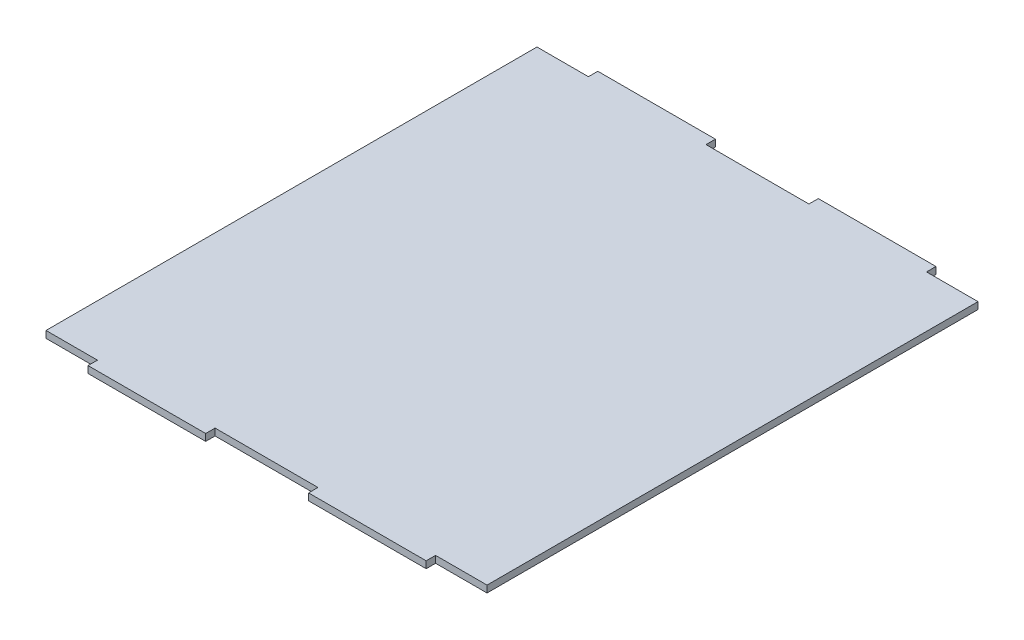
ISO-10303-21;
HEADER;
FILE_DESCRIPTION(('STEP AP214'),'2;1');
FILE_NAME('part.step','',(''),(''),'','','');
FILE_SCHEMA(('AUTOMOTIVE_DESIGN { 1 0 10303 214 1 1 1 1 }'));
ENDSEC;
DATA;
#1=APPLICATION_CONTEXT('core data for automotive mechanical design processes');
#2=APPLICATION_PROTOCOL_DEFINITION('international standard','automotive_design',2000,#1);
#3=PRODUCT_CONTEXT('',#1,'mechanical');
#4=PRODUCT('Part','Part','',(#3));
#5=PRODUCT_RELATED_PRODUCT_CATEGORY('part','',(#4));
#6=PRODUCT_DEFINITION_FORMATION('','',#4);
#7=PRODUCT_DEFINITION_CONTEXT('part definition',#1,'design');
#8=PRODUCT_DEFINITION('design','',#6,#7);
#9=PRODUCT_DEFINITION_SHAPE('','',#8);
#10=(LENGTH_UNIT() NAMED_UNIT(*) SI_UNIT(.MILLI.,.METRE.));
#11=(NAMED_UNIT(*) PLANE_ANGLE_UNIT() SI_UNIT($,.RADIAN.));
#12=(NAMED_UNIT(*) SI_UNIT($,.STERADIAN.) SOLID_ANGLE_UNIT());
#13=UNCERTAINTY_MEASURE_WITH_UNIT(LENGTH_MEASURE(1.E-05),#10,'distance_accuracy_value','');
#14=(GEOMETRIC_REPRESENTATION_CONTEXT(3) GLOBAL_UNCERTAINTY_ASSIGNED_CONTEXT((#13)) GLOBAL_UNIT_ASSIGNED_CONTEXT((#10,
#11,#12)) REPRESENTATION_CONTEXT('',''));
#15=CARTESIAN_POINT('',(0.,0.,0.));
#16=DIRECTION('',(0.,0.,1.));
#17=DIRECTION('',(1.,0.,0.));
#18=AXIS2_PLACEMENT_3D('',#15,#16,#17);
#19=CARTESIAN_POINT('',(708.021771772831,6.7818,384.048));
#20=DIRECTION('',(0.,0.,1.));
#21=DIRECTION('',(1.,0.,0.));
#22=AXIS2_PLACEMENT_3D('',#19,#20,#21);
#23=PLANE('',#22);
#24=DIRECTION('',(-1.,0.,0.));
#25=VECTOR('',#24,1.);
#26=CARTESIAN_POINT('',(708.021771772831,3.81,384.048));
#27=LINE('',#26,#25);
#28=CARTESIAN_POINT('',(730.246771772831,3.81,384.048));
#29=VERTEX_POINT('',#28);
#30=CARTESIAN_POINT('',(708.021771772831,3.81,384.048));
#31=VERTEX_POINT('',#30);
#32=EDGE_CURVE('E202',#29,#31,#27,.T.);
#33=ORIENTED_EDGE('',*,*,#32,.T.);
#34=DIRECTION('',(0.,-1.,0.));
#35=VECTOR('',#34,1.);
#36=CARTESIAN_POINT('',(708.021771772831,6.7818,384.048));
#37=LINE('',#36,#35);
#38=CARTESIAN_POINT('',(708.021771772831,6.7818,384.048));
#39=VERTEX_POINT('',#38);
#40=EDGE_CURVE('E11',#39,#31,#37,.T.);
#41=ORIENTED_EDGE('',*,*,#40,.F.);
#42=DIRECTION('',(-1.,0.,0.));
#43=VECTOR('',#42,1.);
#44=CARTESIAN_POINT('',(708.021771772831,6.7818,384.048));
#45=LINE('',#44,#43);
#46=CARTESIAN_POINT('',(730.246771772831,6.7818,384.048));
#47=VERTEX_POINT('',#46);
#48=EDGE_CURVE('E240',#47,#39,#45,.T.);
#49=ORIENTED_EDGE('',*,*,#48,.F.);
#50=DIRECTION('',(0.,-1.,0.));
#51=VECTOR('',#50,1.);
#52=CARTESIAN_POINT('',(730.246771772831,6.7818,384.048));
#53=LINE('',#52,#51);
#54=EDGE_CURVE('E198',#47,#29,#53,.T.);
#55=ORIENTED_EDGE('',*,*,#54,.T.);
#56=EDGE_LOOP('',(#33,#41,#49,#55));
#57=FACE_BOUND('',#56,.T.);
#58=ADVANCED_FACE('F34',(#57),#23,.F.);
#59=CARTESIAN_POINT('',(708.021771772831,6.7818,379.984));
#60=DIRECTION('',(-1.,0.,0.));
#61=DIRECTION('',(0.,0.,1.));
#62=AXIS2_PLACEMENT_3D('',#59,#60,#61);
#63=PLANE('',#62);
#64=DIRECTION('',(0.,0.,-1.));
#65=VECTOR('',#64,1.);
#66=CARTESIAN_POINT('',(708.021771772831,3.81,379.984));
#67=LINE('',#66,#65);
#68=CARTESIAN_POINT('',(708.021771772831,3.81,379.984));
#69=VERTEX_POINT('',#68);
#70=EDGE_CURVE('E205',#31,#69,#67,.T.);
#71=ORIENTED_EDGE('',*,*,#70,.T.);
#72=DIRECTION('',(0.,-1.,0.));
#73=VECTOR('',#72,1.);
#74=CARTESIAN_POINT('',(708.021771772831,6.7818,379.984));
#75=LINE('',#74,#73);
#76=CARTESIAN_POINT('',(708.021771772831,6.7818,379.984));
#77=VERTEX_POINT('',#76);
#78=EDGE_CURVE('E42',#77,#69,#75,.T.);
#79=ORIENTED_EDGE('',*,*,#78,.F.);
#80=DIRECTION('',(0.,0.,-1.));
#81=VECTOR('',#80,1.);
#82=CARTESIAN_POINT('',(708.021771772831,6.7818,379.984));
#83=LINE('',#82,#81);
#84=EDGE_CURVE('E129',#39,#77,#83,.T.);
#85=ORIENTED_EDGE('',*,*,#84,.F.);
#86=ORIENTED_EDGE('',*,*,#40,.T.);
#87=EDGE_LOOP('',(#71,#79,#85,#86));
#88=FACE_BOUND('',#87,.T.);
#89=ADVANCED_FACE('F358',(#88),#63,.F.);
#90=CARTESIAN_POINT('',(657.221771772832,6.7818,379.984));
#91=DIRECTION('',(0.,0.,1.));
#92=DIRECTION('',(1.,0.,0.));
#93=AXIS2_PLACEMENT_3D('',#90,#91,#92);
#94=PLANE('',#93);
#95=DIRECTION('',(-1.,0.,0.));
#96=VECTOR('',#95,1.);
#97=CARTESIAN_POINT('',(657.221771772832,3.81,379.984));
#98=LINE('',#97,#96);
#99=CARTESIAN_POINT('',(657.221771772832,3.81,379.984));
#100=VERTEX_POINT('',#99);
#101=EDGE_CURVE('E207',#69,#100,#98,.T.);
#102=ORIENTED_EDGE('',*,*,#101,.T.);
#103=DIRECTION('',(0.,-1.,0.));
#104=VECTOR('',#103,1.);
#105=CARTESIAN_POINT('',(657.221771772832,6.7818,379.984));
#106=LINE('',#105,#104);
#107=CARTESIAN_POINT('',(657.221771772832,6.7818,379.984));
#108=VERTEX_POINT('',#107);
#109=EDGE_CURVE('E283',#108,#100,#106,.T.);
#110=ORIENTED_EDGE('',*,*,#109,.F.);
#111=DIRECTION('',(-1.,0.,0.));
#112=VECTOR('',#111,1.);
#113=CARTESIAN_POINT('',(657.221771772832,6.7818,379.984));
#114=LINE('',#113,#112);
#115=EDGE_CURVE('E291',#77,#108,#114,.T.);
#116=ORIENTED_EDGE('',*,*,#115,.F.);
#117=ORIENTED_EDGE('',*,*,#78,.T.);
#118=EDGE_LOOP('',(#102,#110,#116,#117));
#119=FACE_BOUND('',#118,.T.);
#120=ADVANCED_FACE('F289',(#119),#94,.F.);
#121=CARTESIAN_POINT('',(657.221771772832,6.7818,379.984));
#122=DIRECTION('',(1.,0.,0.));
#123=DIRECTION('',(0.,0.,-1.));
#124=AXIS2_PLACEMENT_3D('',#121,#122,#123);
#125=PLANE('',#124);
#126=DIRECTION('',(0.,0.,1.));
#127=VECTOR('',#126,1.);
#128=CARTESIAN_POINT('',(657.221771772832,3.81,379.984));
#129=LINE('',#128,#127);
#130=CARTESIAN_POINT('',(657.221771772832,3.81,384.048));
#131=VERTEX_POINT('',#130);
#132=EDGE_CURVE('E209',#100,#131,#129,.T.);
#133=ORIENTED_EDGE('',*,*,#132,.T.);
#134=DIRECTION('',(0.,-1.,0.));
#135=VECTOR('',#134,1.);
#136=CARTESIAN_POINT('',(657.221771772832,6.7818,384.048));
#137=LINE('',#136,#135);
#138=CARTESIAN_POINT('',(657.221771772832,6.7818,384.048));
#139=VERTEX_POINT('',#138);
#140=EDGE_CURVE('E280',#139,#131,#137,.T.);
#141=ORIENTED_EDGE('',*,*,#140,.F.);
#142=DIRECTION('',(0.,0.,1.));
#143=VECTOR('',#142,1.);
#144=CARTESIAN_POINT('',(657.221771772832,6.7818,379.984));
#145=LINE('',#144,#143);
#146=EDGE_CURVE('E309',#108,#139,#145,.T.);
#147=ORIENTED_EDGE('',*,*,#146,.F.);
#148=ORIENTED_EDGE('',*,*,#109,.T.);
#149=EDGE_LOOP('',(#133,#141,#147,#148));
#150=FACE_BOUND('',#149,.T.);
#151=ADVANCED_FACE('F300',(#150),#125,.F.);
#152=CARTESIAN_POINT('',(612.771771772831,6.7818,384.048));
#153=DIRECTION('',(0.,0.,1.));
#154=DIRECTION('',(1.,0.,0.));
#155=AXIS2_PLACEMENT_3D('',#152,#153,#154);
#156=PLANE('',#155);
#157=DIRECTION('',(-1.,0.,0.));
#158=VECTOR('',#157,1.);
#159=CARTESIAN_POINT('',(612.771771772831,3.81,384.048));
#160=LINE('',#159,#158);
#161=CARTESIAN_POINT('',(612.771771772831,3.81,384.048));
#162=VERTEX_POINT('',#161);
#163=EDGE_CURVE('E211',#131,#162,#160,.T.);
#164=ORIENTED_EDGE('',*,*,#163,.T.);
#165=DIRECTION('',(0.,-1.,0.));
#166=VECTOR('',#165,1.);
#167=CARTESIAN_POINT('',(612.771771772831,6.7818,384.048));
#168=LINE('',#167,#166);
#169=CARTESIAN_POINT('',(612.771771772831,6.7818,384.048));
#170=VERTEX_POINT('',#169);
#171=EDGE_CURVE('E277',#170,#162,#168,.T.);
#172=ORIENTED_EDGE('',*,*,#171,.F.);
#173=DIRECTION('',(-1.,0.,0.));
#174=VECTOR('',#173,1.);
#175=CARTESIAN_POINT('',(612.771771772831,6.7818,384.048));
#176=LINE('',#175,#174);
#177=EDGE_CURVE('E306',#139,#170,#176,.T.);
#178=ORIENTED_EDGE('',*,*,#177,.F.);
#179=ORIENTED_EDGE('',*,*,#140,.T.);
#180=EDGE_LOOP('',(#164,#172,#178,#179));
#181=FACE_BOUND('',#180,.T.);
#182=ADVANCED_FACE('F304',(#181),#156,.F.);
#183=CARTESIAN_POINT('',(612.771771772831,6.7818,379.984));
#184=DIRECTION('',(-1.,0.,0.));
#185=DIRECTION('',(0.,0.,1.));
#186=AXIS2_PLACEMENT_3D('',#183,#184,#185);
#187=PLANE('',#186);
#188=DIRECTION('',(0.,0.,-1.));
#189=VECTOR('',#188,1.);
#190=CARTESIAN_POINT('',(612.771771772831,3.81,379.984));
#191=LINE('',#190,#189);
#192=CARTESIAN_POINT('',(612.771771772831,3.81,379.984));
#193=VERTEX_POINT('',#192);
#194=EDGE_CURVE('E213',#162,#193,#191,.T.);
#195=ORIENTED_EDGE('',*,*,#194,.T.);
#196=DIRECTION('',(0.,-1.,0.));
#197=VECTOR('',#196,1.);
#198=CARTESIAN_POINT('',(612.771771772831,6.7818,379.984));
#199=LINE('',#198,#197);
#200=CARTESIAN_POINT('',(612.771771772831,6.7818,379.984));
#201=VERTEX_POINT('',#200);
#202=EDGE_CURVE('E274',#201,#193,#199,.T.);
#203=ORIENTED_EDGE('',*,*,#202,.F.);
#204=DIRECTION('',(0.,0.,-1.));
#205=VECTOR('',#204,1.);
#206=CARTESIAN_POINT('',(612.771771772831,6.7818,379.984));
#207=LINE('',#206,#205);
#208=EDGE_CURVE('E308',#170,#201,#207,.T.);
#209=ORIENTED_EDGE('',*,*,#208,.F.);
#210=ORIENTED_EDGE('',*,*,#171,.T.);
#211=EDGE_LOOP('',(#195,#203,#209,#210));
#212=FACE_BOUND('',#211,.T.);
#213=ADVANCED_FACE('F371',(#212),#187,.F.);
#214=CARTESIAN_POINT('',(561.971771772831,6.7818,379.984));
#215=DIRECTION('',(0.,0.,1.));
#216=DIRECTION('',(1.,0.,0.));
#217=AXIS2_PLACEMENT_3D('',#214,#215,#216);
#218=PLANE('',#217);
#219=DIRECTION('',(-1.,0.,0.));
#220=VECTOR('',#219,1.);
#221=CARTESIAN_POINT('',(561.971771772831,3.81,379.984));
#222=LINE('',#221,#220);
#223=CARTESIAN_POINT('',(561.971771772831,3.81,379.984));
#224=VERTEX_POINT('',#223);
#225=EDGE_CURVE('E215',#193,#224,#222,.T.);
#226=ORIENTED_EDGE('',*,*,#225,.T.);
#227=DIRECTION('',(0.,-1.,0.));
#228=VECTOR('',#227,1.);
#229=CARTESIAN_POINT('',(561.971771772831,6.7818,379.984));
#230=LINE('',#229,#228);
#231=CARTESIAN_POINT('',(561.971771772831,6.7818,379.984));
#232=VERTEX_POINT('',#231);
#233=EDGE_CURVE('E271',#232,#224,#230,.T.);
#234=ORIENTED_EDGE('',*,*,#233,.F.);
#235=DIRECTION('',(-1.,0.,0.));
#236=VECTOR('',#235,1.);
#237=CARTESIAN_POINT('',(561.971771772831,6.7818,379.984));
#238=LINE('',#237,#236);
#239=EDGE_CURVE('E311',#201,#232,#238,.T.);
#240=ORIENTED_EDGE('',*,*,#239,.F.);
#241=ORIENTED_EDGE('',*,*,#202,.T.);
#242=EDGE_LOOP('',(#226,#234,#240,#241));
#243=FACE_BOUND('',#242,.T.);
#244=ADVANCED_FACE('F374',(#243),#218,.F.);
#245=CARTESIAN_POINT('',(561.971771772831,6.7818,379.984));
#246=DIRECTION('',(1.,0.,0.));
#247=DIRECTION('',(0.,0.,-1.));
#248=AXIS2_PLACEMENT_3D('',#245,#246,#247);
#249=PLANE('',#248);
#250=DIRECTION('',(0.,0.,1.));
#251=VECTOR('',#250,1.);
#252=CARTESIAN_POINT('',(561.971771772831,3.81,379.984));
#253=LINE('',#252,#251);
#254=CARTESIAN_POINT('',(561.971771772831,3.81,384.048));
#255=VERTEX_POINT('',#254);
#256=EDGE_CURVE('E217',#224,#255,#253,.T.);
#257=ORIENTED_EDGE('',*,*,#256,.T.);
#258=DIRECTION('',(0.,-1.,0.));
#259=VECTOR('',#258,1.);
#260=CARTESIAN_POINT('',(561.971771772831,6.7818,384.048));
#261=LINE('',#260,#259);
#262=CARTESIAN_POINT('',(561.971771772831,6.7818,384.048));
#263=VERTEX_POINT('',#262);
#264=EDGE_CURVE('E268',#263,#255,#261,.T.);
#265=ORIENTED_EDGE('',*,*,#264,.F.);
#266=DIRECTION('',(0.,0.,1.));
#267=VECTOR('',#266,1.);
#268=CARTESIAN_POINT('',(561.971771772831,6.7818,379.984));
#269=LINE('',#268,#267);
#270=EDGE_CURVE('E317',#232,#263,#269,.T.);
#271=ORIENTED_EDGE('',*,*,#270,.F.);
#272=ORIENTED_EDGE('',*,*,#233,.T.);
#273=EDGE_LOOP('',(#257,#265,#271,#272));
#274=FACE_BOUND('',#273,.T.);
#275=ADVANCED_FACE('F378',(#274),#249,.F.);
#276=CARTESIAN_POINT('',(539.746771772831,6.7818,384.048));
#277=DIRECTION('',(0.,0.,1.));
#278=DIRECTION('',(1.,0.,0.));
#279=AXIS2_PLACEMENT_3D('',#276,#277,#278);
#280=PLANE('',#279);
#281=DIRECTION('',(-1.,0.,0.));
#282=VECTOR('',#281,1.);
#283=CARTESIAN_POINT('',(539.746771772831,3.81,384.048));
#284=LINE('',#283,#282);
#285=CARTESIAN_POINT('',(539.746771772831,3.81,384.048));
#286=VERTEX_POINT('',#285);
#287=EDGE_CURVE('E219',#255,#286,#284,.T.);
#288=ORIENTED_EDGE('',*,*,#287,.T.);
#289=DIRECTION('',(0.,-1.,0.));
#290=VECTOR('',#289,1.);
#291=CARTESIAN_POINT('',(539.746771772831,6.7818,384.048));
#292=LINE('',#291,#290);
#293=CARTESIAN_POINT('',(539.746771772831,6.7818,384.048));
#294=VERTEX_POINT('',#293);
#295=EDGE_CURVE('E265',#294,#286,#292,.T.);
#296=ORIENTED_EDGE('',*,*,#295,.F.);
#297=DIRECTION('',(-1.,0.,0.));
#298=VECTOR('',#297,1.);
#299=CARTESIAN_POINT('',(539.746771772831,6.7818,384.048));
#300=LINE('',#299,#298);
#301=EDGE_CURVE('E319',#263,#294,#300,.T.);
#302=ORIENTED_EDGE('',*,*,#301,.F.);
#303=ORIENTED_EDGE('',*,*,#264,.T.);
#304=EDGE_LOOP('',(#288,#296,#302,#303));
#305=FACE_BOUND('',#304,.T.);
#306=ADVANCED_FACE('F382',(#305),#280,.F.);
#307=CARTESIAN_POINT('',(539.746771772831,6.7818,384.048));
#308=DIRECTION('',(1.,0.,0.));
#309=DIRECTION('',(0.,0.,-1.));
#310=AXIS2_PLACEMENT_3D('',#307,#308,#309);
#311=PLANE('',#310);
#312=DIRECTION('',(0.,0.,1.));
#313=VECTOR('',#312,1.);
#314=CARTESIAN_POINT('',(539.746771772831,3.81,384.048));
#315=LINE('',#314,#313);
#316=CARTESIAN_POINT('',(539.746771772831,3.81,596.1126));
#317=VERTEX_POINT('',#316);
#318=EDGE_CURVE('E221',#286,#317,#315,.T.);
#319=ORIENTED_EDGE('',*,*,#318,.T.);
#320=DIRECTION('',(0.,-1.,0.));
#321=VECTOR('',#320,1.);
#322=CARTESIAN_POINT('',(539.746771772831,6.7818,596.1126));
#323=LINE('',#322,#321);
#324=CARTESIAN_POINT('',(539.746771772831,6.7818,596.1126));
#325=VERTEX_POINT('',#324);
#326=EDGE_CURVE('E262',#325,#317,#323,.T.);
#327=ORIENTED_EDGE('',*,*,#326,.F.);
#328=DIRECTION('',(0.,0.,1.));
#329=VECTOR('',#328,1.);
#330=CARTESIAN_POINT('',(539.746771772831,6.7818,384.048));
#331=LINE('',#330,#329);
#332=EDGE_CURVE('E321',#294,#325,#331,.T.);
#333=ORIENTED_EDGE('',*,*,#332,.F.);
#334=ORIENTED_EDGE('',*,*,#295,.T.);
#335=EDGE_LOOP('',(#319,#327,#333,#334));
#336=FACE_BOUND('',#335,.T.);
#337=ADVANCED_FACE('F386',(#336),#311,.F.);
#338=CARTESIAN_POINT('',(539.746771772831,6.7818,596.1126));
#339=DIRECTION('',(0.,0.,-1.));
#340=DIRECTION('',(-1.,0.,0.));
#341=AXIS2_PLACEMENT_3D('',#338,#339,#340);
#342=PLANE('',#341);
#343=DIRECTION('',(1.,0.,0.));
#344=VECTOR('',#343,1.);
#345=CARTESIAN_POINT('',(539.746771772831,3.81,596.1126));
#346=LINE('',#345,#344);
#347=CARTESIAN_POINT('',(561.971771772831,3.81,596.1126));
#348=VERTEX_POINT('',#347);
#349=EDGE_CURVE('E223',#317,#348,#346,.T.);
#350=ORIENTED_EDGE('',*,*,#349,.T.);
#351=DIRECTION('',(0.,-1.,0.));
#352=VECTOR('',#351,1.);
#353=CARTESIAN_POINT('',(561.971771772831,6.7818,596.1126));
#354=LINE('',#353,#352);
#355=CARTESIAN_POINT('',(561.971771772831,6.7818,596.1126));
#356=VERTEX_POINT('',#355);
#357=EDGE_CURVE('E259',#356,#348,#354,.T.);
#358=ORIENTED_EDGE('',*,*,#357,.F.);
#359=DIRECTION('',(1.,0.,0.));
#360=VECTOR('',#359,1.);
#361=CARTESIAN_POINT('',(539.746771772831,6.7818,596.1126));
#362=LINE('',#361,#360);
#363=EDGE_CURVE('E323',#325,#356,#362,.T.);
#364=ORIENTED_EDGE('',*,*,#363,.F.);
#365=ORIENTED_EDGE('',*,*,#326,.T.);
#366=EDGE_LOOP('',(#350,#358,#364,#365));
#367=FACE_BOUND('',#366,.T.);
#368=ADVANCED_FACE('F390',(#367),#342,.F.);
#369=CARTESIAN_POINT('',(561.971771772831,6.7818,596.1126));
#370=DIRECTION('',(1.,0.,0.));
#371=DIRECTION('',(0.,0.,-1.));
#372=AXIS2_PLACEMENT_3D('',#369,#370,#371);
#373=PLANE('',#372);
#374=DIRECTION('',(0.,0.,1.));
#375=VECTOR('',#374,1.);
#376=CARTESIAN_POINT('',(561.971771772831,3.81,596.1126));
#377=LINE('',#376,#375);
#378=CARTESIAN_POINT('',(561.971771772831,3.81,600.1766));
#379=VERTEX_POINT('',#378);
#380=EDGE_CURVE('E225',#348,#379,#377,.T.);
#381=ORIENTED_EDGE('',*,*,#380,.T.);
#382=DIRECTION('',(0.,-1.,0.));
#383=VECTOR('',#382,1.);
#384=CARTESIAN_POINT('',(561.971771772831,6.7818,600.1766));
#385=LINE('',#384,#383);
#386=CARTESIAN_POINT('',(561.971771772831,6.7818,600.1766));
#387=VERTEX_POINT('',#386);
#388=EDGE_CURVE('E256',#387,#379,#385,.T.);
#389=ORIENTED_EDGE('',*,*,#388,.F.);
#390=DIRECTION('',(0.,0.,1.));
#391=VECTOR('',#390,1.);
#392=CARTESIAN_POINT('',(561.971771772831,6.7818,596.1126));
#393=LINE('',#392,#391);
#394=EDGE_CURVE('E325',#356,#387,#393,.T.);
#395=ORIENTED_EDGE('',*,*,#394,.F.);
#396=ORIENTED_EDGE('',*,*,#357,.T.);
#397=EDGE_LOOP('',(#381,#389,#395,#396));
#398=FACE_BOUND('',#397,.T.);
#399=ADVANCED_FACE('F394',(#398),#373,.F.);
#400=CARTESIAN_POINT('',(561.971771772831,6.7818,600.1766));
#401=DIRECTION('',(0.,0.,-1.));
#402=DIRECTION('',(-1.,0.,0.));
#403=AXIS2_PLACEMENT_3D('',#400,#401,#402);
#404=PLANE('',#403);
#405=DIRECTION('',(1.,0.,0.));
#406=VECTOR('',#405,1.);
#407=CARTESIAN_POINT('',(561.971771772831,3.81,600.1766));
#408=LINE('',#407,#406);
#409=CARTESIAN_POINT('',(612.771771772831,3.81,600.1766));
#410=VERTEX_POINT('',#409);
#411=EDGE_CURVE('E227',#379,#410,#408,.T.);
#412=ORIENTED_EDGE('',*,*,#411,.T.);
#413=DIRECTION('',(0.,-1.,0.));
#414=VECTOR('',#413,1.);
#415=CARTESIAN_POINT('',(612.771771772831,6.7818,600.1766));
#416=LINE('',#415,#414);
#417=CARTESIAN_POINT('',(612.771771772831,6.7818,600.1766));
#418=VERTEX_POINT('',#417);
#419=EDGE_CURVE('E253',#418,#410,#416,.T.);
#420=ORIENTED_EDGE('',*,*,#419,.F.);
#421=DIRECTION('',(1.,0.,0.));
#422=VECTOR('',#421,1.);
#423=CARTESIAN_POINT('',(561.971771772831,6.7818,600.1766));
#424=LINE('',#423,#422);
#425=EDGE_CURVE('E327',#387,#418,#424,.T.);
#426=ORIENTED_EDGE('',*,*,#425,.F.);
#427=ORIENTED_EDGE('',*,*,#388,.T.);
#428=EDGE_LOOP('',(#412,#420,#426,#427));
#429=FACE_BOUND('',#428,.T.);
#430=ADVANCED_FACE('F398',(#429),#404,.F.);
#431=CARTESIAN_POINT('',(612.771771772831,6.7818,600.1766));
#432=DIRECTION('',(-1.,0.,0.));
#433=DIRECTION('',(0.,0.,1.));
#434=AXIS2_PLACEMENT_3D('',#431,#432,#433);
#435=PLANE('',#434);
#436=DIRECTION('',(0.,0.,-1.));
#437=VECTOR('',#436,1.);
#438=CARTESIAN_POINT('',(612.771771772831,3.81,600.1766));
#439=LINE('',#438,#437);
#440=CARTESIAN_POINT('',(612.771771772831,3.81,596.1126));
#441=VERTEX_POINT('',#440);
#442=EDGE_CURVE('E229',#410,#441,#439,.T.);
#443=ORIENTED_EDGE('',*,*,#442,.T.);
#444=DIRECTION('',(0.,-1.,0.));
#445=VECTOR('',#444,1.);
#446=CARTESIAN_POINT('',(612.771771772831,6.7818,596.1126));
#447=LINE('',#446,#445);
#448=CARTESIAN_POINT('',(612.771771772831,6.7818,596.1126));
#449=VERTEX_POINT('',#448);
#450=EDGE_CURVE('E250',#449,#441,#447,.T.);
#451=ORIENTED_EDGE('',*,*,#450,.F.);
#452=DIRECTION('',(0.,0.,-1.));
#453=VECTOR('',#452,1.);
#454=CARTESIAN_POINT('',(612.771771772831,6.7818,600.1766));
#455=LINE('',#454,#453);
#456=EDGE_CURVE('E329',#418,#449,#455,.T.);
#457=ORIENTED_EDGE('',*,*,#456,.F.);
#458=ORIENTED_EDGE('',*,*,#419,.T.);
#459=EDGE_LOOP('',(#443,#451,#457,#458));
#460=FACE_BOUND('',#459,.T.);
#461=ADVANCED_FACE('F402',(#460),#435,.F.);
#462=CARTESIAN_POINT('',(612.771771772831,6.7818,596.1126));
#463=DIRECTION('',(0.,0.,-1.));
#464=DIRECTION('',(-1.,0.,0.));
#465=AXIS2_PLACEMENT_3D('',#462,#463,#464);
#466=PLANE('',#465);
#467=DIRECTION('',(1.,0.,0.));
#468=VECTOR('',#467,1.);
#469=CARTESIAN_POINT('',(612.771771772831,3.81,596.1126));
#470=LINE('',#469,#468);
#471=CARTESIAN_POINT('',(657.221771772832,3.81,596.1126));
#472=VERTEX_POINT('',#471);
#473=EDGE_CURVE('E231',#441,#472,#470,.T.);
#474=ORIENTED_EDGE('',*,*,#473,.T.);
#475=DIRECTION('',(0.,-1.,0.));
#476=VECTOR('',#475,1.);
#477=CARTESIAN_POINT('',(657.221771772832,6.7818,596.1126));
#478=LINE('',#477,#476);
#479=CARTESIAN_POINT('',(657.221771772832,6.7818,596.1126));
#480=VERTEX_POINT('',#479);
#481=EDGE_CURVE('E247',#480,#472,#478,.T.);
#482=ORIENTED_EDGE('',*,*,#481,.F.);
#483=DIRECTION('',(1.,0.,0.));
#484=VECTOR('',#483,1.);
#485=CARTESIAN_POINT('',(612.771771772831,6.7818,596.1126));
#486=LINE('',#485,#484);
#487=EDGE_CURVE('E331',#449,#480,#486,.T.);
#488=ORIENTED_EDGE('',*,*,#487,.F.);
#489=ORIENTED_EDGE('',*,*,#450,.T.);
#490=EDGE_LOOP('',(#474,#482,#488,#489));
#491=FACE_BOUND('',#490,.T.);
#492=ADVANCED_FACE('F406',(#491),#466,.F.);
#493=CARTESIAN_POINT('',(657.221771772832,6.7818,596.1126));
#494=DIRECTION('',(1.,0.,0.));
#495=DIRECTION('',(0.,0.,-1.));
#496=AXIS2_PLACEMENT_3D('',#493,#494,#495);
#497=PLANE('',#496);
#498=DIRECTION('',(0.,0.,1.));
#499=VECTOR('',#498,1.);
#500=CARTESIAN_POINT('',(657.221771772832,3.81,596.1126));
#501=LINE('',#500,#499);
#502=CARTESIAN_POINT('',(657.221771772832,3.81,600.1766));
#503=VERTEX_POINT('',#502);
#504=EDGE_CURVE('E233',#472,#503,#501,.T.);
#505=ORIENTED_EDGE('',*,*,#504,.T.);
#506=DIRECTION('',(0.,-1.,0.));
#507=VECTOR('',#506,1.);
#508=CARTESIAN_POINT('',(657.221771772832,6.7818,600.1766));
#509=LINE('',#508,#507);
#510=CARTESIAN_POINT('',(657.221771772832,6.7818,600.1766));
#511=VERTEX_POINT('',#510);
#512=EDGE_CURVE('E244',#511,#503,#509,.T.);
#513=ORIENTED_EDGE('',*,*,#512,.F.);
#514=DIRECTION('',(0.,0.,1.));
#515=VECTOR('',#514,1.);
#516=CARTESIAN_POINT('',(657.221771772832,6.7818,596.1126));
#517=LINE('',#516,#515);
#518=EDGE_CURVE('E333',#480,#511,#517,.T.);
#519=ORIENTED_EDGE('',*,*,#518,.F.);
#520=ORIENTED_EDGE('',*,*,#481,.T.);
#521=EDGE_LOOP('',(#505,#513,#519,#520));
#522=FACE_BOUND('',#521,.T.);
#523=ADVANCED_FACE('F339',(#522),#497,.F.);
#524=CARTESIAN_POINT('',(657.221771772832,6.7818,600.1766));
#525=DIRECTION('',(0.,0.,-1.));
#526=DIRECTION('',(-1.,0.,0.));
#527=AXIS2_PLACEMENT_3D('',#524,#525,#526);
#528=PLANE('',#527);
#529=DIRECTION('',(1.,0.,0.));
#530=VECTOR('',#529,1.);
#531=CARTESIAN_POINT('',(657.221771772832,3.81,600.1766));
#532=LINE('',#531,#530);
#533=CARTESIAN_POINT('',(708.021771772831,3.81,600.1766));
#534=VERTEX_POINT('',#533);
#535=EDGE_CURVE('E235',#503,#534,#532,.T.);
#536=ORIENTED_EDGE('',*,*,#535,.T.);
#537=DIRECTION('',(0.,-1.,0.));
#538=VECTOR('',#537,1.);
#539=CARTESIAN_POINT('',(708.021771772831,6.7818,600.1766));
#540=LINE('',#539,#538);
#541=CARTESIAN_POINT('',(708.021771772831,6.7818,600.1766));
#542=VERTEX_POINT('',#541);
#543=EDGE_CURVE('E193',#542,#534,#540,.T.);
#544=ORIENTED_EDGE('',*,*,#543,.F.);
#545=DIRECTION('',(1.,0.,0.));
#546=VECTOR('',#545,1.);
#547=CARTESIAN_POINT('',(657.221771772832,6.7818,600.1766));
#548=LINE('',#547,#546);
#549=EDGE_CURVE('E184',#511,#542,#548,.T.);
#550=ORIENTED_EDGE('',*,*,#549,.F.);
#551=ORIENTED_EDGE('',*,*,#512,.T.);
#552=EDGE_LOOP('',(#536,#544,#550,#551));
#553=FACE_BOUND('',#552,.T.);
#554=ADVANCED_FACE('F343',(#553),#528,.F.);
#555=CARTESIAN_POINT('',(708.021771772831,6.7818,600.1766));
#556=DIRECTION('',(-1.,0.,0.));
#557=DIRECTION('',(0.,0.,1.));
#558=AXIS2_PLACEMENT_3D('',#555,#556,#557);
#559=PLANE('',#558);
#560=DIRECTION('',(0.,0.,-1.));
#561=VECTOR('',#560,1.);
#562=CARTESIAN_POINT('',(708.021771772831,3.81,600.1766));
#563=LINE('',#562,#561);
#564=CARTESIAN_POINT('',(708.021771772831,3.81,596.1126));
#565=VERTEX_POINT('',#564);
#566=EDGE_CURVE('E192',#534,#565,#563,.T.);
#567=ORIENTED_EDGE('',*,*,#566,.T.);
#568=DIRECTION('',(0.,-1.,0.));
#569=VECTOR('',#568,1.);
#570=CARTESIAN_POINT('',(708.021771772831,6.7818,596.1126));
#571=LINE('',#570,#569);
#572=CARTESIAN_POINT('',(708.021771772831,6.7818,596.1126));
#573=VERTEX_POINT('',#572);
#574=EDGE_CURVE('E189',#573,#565,#571,.T.);
#575=ORIENTED_EDGE('',*,*,#574,.F.);
#576=DIRECTION('',(0.,0.,-1.));
#577=VECTOR('',#576,1.);
#578=CARTESIAN_POINT('',(708.021771772831,6.7818,600.1766));
#579=LINE('',#578,#577);
#580=EDGE_CURVE('E178',#542,#573,#579,.T.);
#581=ORIENTED_EDGE('',*,*,#580,.F.);
#582=ORIENTED_EDGE('',*,*,#543,.T.);
#583=EDGE_LOOP('',(#567,#575,#581,#582));
#584=FACE_BOUND('',#583,.T.);
#585=ADVANCED_FACE('F190',(#584),#559,.F.);
#586=CARTESIAN_POINT('',(708.021771772831,6.7818,596.1126));
#587=DIRECTION('',(0.,0.,-1.));
#588=DIRECTION('',(-1.,0.,0.));
#589=AXIS2_PLACEMENT_3D('',#586,#587,#588);
#590=PLANE('',#589);
#591=DIRECTION('',(1.,0.,0.));
#592=VECTOR('',#591,1.);
#593=CARTESIAN_POINT('',(708.021771772831,3.81,596.1126));
#594=LINE('',#593,#592);
#595=CARTESIAN_POINT('',(730.246771772831,3.81,596.1126));
#596=VERTEX_POINT('',#595);
#597=EDGE_CURVE('E115',#565,#596,#594,.T.);
#598=ORIENTED_EDGE('',*,*,#597,.T.);
#599=DIRECTION('',(0.,-1.,0.));
#600=VECTOR('',#599,1.);
#601=CARTESIAN_POINT('',(730.246771772831,6.7818,596.1126));
#602=LINE('',#601,#600);
#603=CARTESIAN_POINT('',(730.246771772831,6.7818,596.1126));
#604=VERTEX_POINT('',#603);
#605=EDGE_CURVE('E194',#604,#596,#602,.T.);
#606=ORIENTED_EDGE('',*,*,#605,.F.);
#607=DIRECTION('',(1.,0.,0.));
#608=VECTOR('',#607,1.);
#609=CARTESIAN_POINT('',(708.021771772831,6.7818,596.1126));
#610=LINE('',#609,#608);
#611=EDGE_CURVE('E182',#573,#604,#610,.T.);
#612=ORIENTED_EDGE('',*,*,#611,.F.);
#613=ORIENTED_EDGE('',*,*,#574,.T.);
#614=EDGE_LOOP('',(#598,#606,#612,#613));
#615=FACE_BOUND('',#614,.T.);
#616=ADVANCED_FACE('F196',(#615),#590,.F.);
#617=CARTESIAN_POINT('',(730.246771772831,6.7818,384.048));
#618=DIRECTION('',(-1.,0.,0.));
#619=DIRECTION('',(0.,0.,1.));
#620=AXIS2_PLACEMENT_3D('',#617,#618,#619);
#621=PLANE('',#620);
#622=DIRECTION('',(0.,0.,-1.));
#623=VECTOR('',#622,1.);
#624=CARTESIAN_POINT('',(730.246771772831,3.81,384.048));
#625=LINE('',#624,#623);
#626=EDGE_CURVE('E121',#596,#29,#625,.T.);
#627=ORIENTED_EDGE('',*,*,#626,.T.);
#628=ORIENTED_EDGE('',*,*,#54,.F.);
#629=DIRECTION('',(0.,0.,-1.));
#630=VECTOR('',#629,1.);
#631=CARTESIAN_POINT('',(730.246771772831,6.7818,384.048));
#632=LINE('',#631,#630);
#633=EDGE_CURVE('E50',#604,#47,#632,.T.);
#634=ORIENTED_EDGE('',*,*,#633,.F.);
#635=ORIENTED_EDGE('',*,*,#605,.T.);
#636=EDGE_LOOP('',(#627,#628,#634,#635));
#637=FACE_BOUND('',#636,.T.);
#638=ADVANCED_FACE('F347',(#637),#621,.F.);
#639=CARTESIAN_POINT('',(0.,6.7818,0.));
#640=DIRECTION('',(0.,-1.,0.));
#641=DIRECTION('',(0.,0.,-1.));
#642=AXIS2_PLACEMENT_3D('',#639,#640,#641);
#643=PLANE('',#642);
#644=ORIENTED_EDGE('',*,*,#48,.T.);
#645=ORIENTED_EDGE('',*,*,#84,.T.);
#646=ORIENTED_EDGE('',*,*,#115,.T.);
#647=ORIENTED_EDGE('',*,*,#146,.T.);
#648=ORIENTED_EDGE('',*,*,#177,.T.);
#649=ORIENTED_EDGE('',*,*,#208,.T.);
#650=ORIENTED_EDGE('',*,*,#239,.T.);
#651=ORIENTED_EDGE('',*,*,#270,.T.);
#652=ORIENTED_EDGE('',*,*,#301,.T.);
#653=ORIENTED_EDGE('',*,*,#332,.T.);
#654=ORIENTED_EDGE('',*,*,#363,.T.);
#655=ORIENTED_EDGE('',*,*,#394,.T.);
#656=ORIENTED_EDGE('',*,*,#425,.T.);
#657=ORIENTED_EDGE('',*,*,#456,.T.);
#658=ORIENTED_EDGE('',*,*,#487,.T.);
#659=ORIENTED_EDGE('',*,*,#518,.T.);
#660=ORIENTED_EDGE('',*,*,#549,.T.);
#661=ORIENTED_EDGE('',*,*,#580,.T.);
#662=ORIENTED_EDGE('',*,*,#611,.T.);
#663=ORIENTED_EDGE('',*,*,#633,.T.);
#664=EDGE_LOOP('',(#644,#645,#646,#647,#648,#649,#650,#651,#652,#653,#654,#655,#656,#657,#658,
#659,#660,#661,#662,#663));
#665=FACE_BOUND('',#664,.T.);
#666=ADVANCED_FACE('F180',(#665),#643,.F.);
#667=CARTESIAN_POINT('',(0.,3.81,0.));
#668=DIRECTION('',(0.,-1.,0.));
#669=DIRECTION('',(0.,0.,-1.));
#670=AXIS2_PLACEMENT_3D('',#667,#668,#669);
#671=PLANE('',#670);
#672=ORIENTED_EDGE('',*,*,#32,.F.);
#673=ORIENTED_EDGE('',*,*,#626,.F.);
#674=ORIENTED_EDGE('',*,*,#597,.F.);
#675=ORIENTED_EDGE('',*,*,#566,.F.);
#676=ORIENTED_EDGE('',*,*,#535,.F.);
#677=ORIENTED_EDGE('',*,*,#504,.F.);
#678=ORIENTED_EDGE('',*,*,#473,.F.);
#679=ORIENTED_EDGE('',*,*,#442,.F.);
#680=ORIENTED_EDGE('',*,*,#411,.F.);
#681=ORIENTED_EDGE('',*,*,#380,.F.);
#682=ORIENTED_EDGE('',*,*,#349,.F.);
#683=ORIENTED_EDGE('',*,*,#318,.F.);
#684=ORIENTED_EDGE('',*,*,#287,.F.);
#685=ORIENTED_EDGE('',*,*,#256,.F.);
#686=ORIENTED_EDGE('',*,*,#225,.F.);
#687=ORIENTED_EDGE('',*,*,#194,.F.);
#688=ORIENTED_EDGE('',*,*,#163,.F.);
#689=ORIENTED_EDGE('',*,*,#132,.F.);
#690=ORIENTED_EDGE('',*,*,#101,.F.);
#691=ORIENTED_EDGE('',*,*,#70,.F.);
#692=EDGE_LOOP('',(#672,#673,#674,#675,#676,#677,#678,#679,#680,#681,#682,#683,#684,#685,#686,
#687,#688,#689,#690,#691));
#693=FACE_BOUND('',#692,.T.);
#694=ADVANCED_FACE('F295',(#693),#671,.T.);
#695=CLOSED_SHELL('',(#58,#89,#120,#151,#182,#213,#244,#275,#306,#337,#368,#399,#430,#461,#492,
#523,#554,#585,#616,#638,#666,#694));
#696=MANIFOLD_SOLID_BREP('B2',#695);
#697=ADVANCED_BREP_SHAPE_REPRESENTATION('',(#18,#696),#14);
#698=SHAPE_DEFINITION_REPRESENTATION(#9,#697);
ENDSEC;
END-ISO-10303-21;
